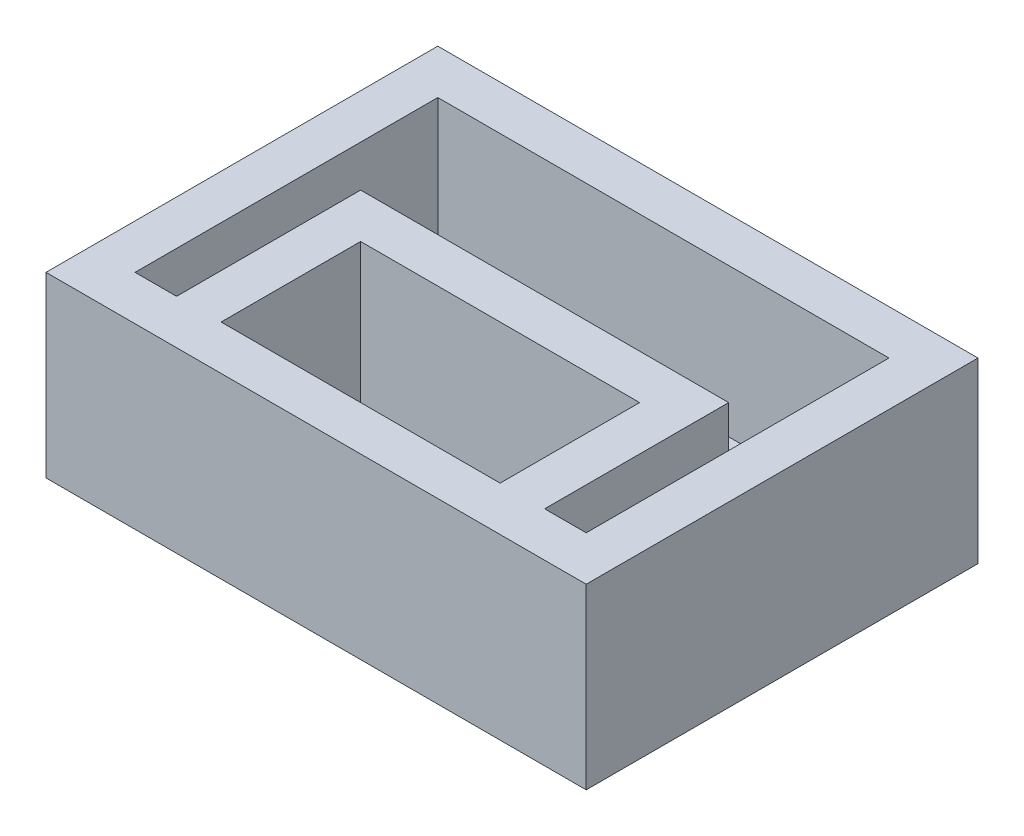
ISO-10303-21;
HEADER;
FILE_DESCRIPTION(('STEP AP214'),'2;1');
FILE_NAME('part.step','',(''),(''),'','','');
FILE_SCHEMA(('AUTOMOTIVE_DESIGN { 1 0 10303 214 1 1 1 1 }'));
ENDSEC;
DATA;
#1=APPLICATION_CONTEXT('core data for automotive mechanical design processes');
#2=APPLICATION_PROTOCOL_DEFINITION('international standard','automotive_design',2000,#1);
#3=PRODUCT_CONTEXT('',#1,'mechanical');
#4=PRODUCT('Part','Part','',(#3));
#5=PRODUCT_RELATED_PRODUCT_CATEGORY('part','',(#4));
#6=PRODUCT_DEFINITION_FORMATION('','',#4);
#7=PRODUCT_DEFINITION_CONTEXT('part definition',#1,'design');
#8=PRODUCT_DEFINITION('design','',#6,#7);
#9=PRODUCT_DEFINITION_SHAPE('','',#8);
#10=(LENGTH_UNIT() NAMED_UNIT(*) SI_UNIT(.MILLI.,.METRE.));
#11=(NAMED_UNIT(*) PLANE_ANGLE_UNIT() SI_UNIT($,.RADIAN.));
#12=(NAMED_UNIT(*) SI_UNIT($,.STERADIAN.) SOLID_ANGLE_UNIT());
#13=UNCERTAINTY_MEASURE_WITH_UNIT(LENGTH_MEASURE(1.E-05),#10,'distance_accuracy_value','');
#14=(GEOMETRIC_REPRESENTATION_CONTEXT(3) GLOBAL_UNCERTAINTY_ASSIGNED_CONTEXT((#13)) GLOBAL_UNIT_ASSIGNED_CONTEXT((#10,
#11,#12)) REPRESENTATION_CONTEXT('',''));
#15=CARTESIAN_POINT('',(0.,0.,0.));
#16=DIRECTION('',(0.,0.,1.));
#17=DIRECTION('',(1.,0.,0.));
#18=AXIS2_PLACEMENT_3D('',#15,#16,#17);
#19=CARTESIAN_POINT('',(-7.6,5.,-5.1));
#20=DIRECTION('',(0.,0.,1.));
#21=DIRECTION('',(1.,0.,0.));
#22=AXIS2_PLACEMENT_3D('',#19,#20,#21);
#23=PLANE('',#22);
#24=DIRECTION('',(-1.,0.,0.));
#25=VECTOR('',#24,1.);
#26=CARTESIAN_POINT('',(-7.6,0.,-5.1));
#27=LINE('',#26,#25);
#28=CARTESIAN_POINT('',(6.2,0.,-5.1));
#29=VERTEX_POINT('',#28);
#30=CARTESIAN_POINT('',(-6.2,0.,-5.1));
#31=VERTEX_POINT('',#30);
#32=EDGE_CURVE('E224',#29,#31,#27,.T.);
#33=ORIENTED_EDGE('',*,*,#32,.F.);
#34=DIRECTION('',(0.,-1.,0.));
#35=VECTOR('',#34,1.);
#36=CARTESIAN_POINT('',(6.2,1.,-5.1));
#37=LINE('',#36,#35);
#38=CARTESIAN_POINT('',(6.2,1.,-5.1));
#39=VERTEX_POINT('',#38);
#40=EDGE_CURVE('E181',#39,#29,#37,.T.);
#41=ORIENTED_EDGE('',*,*,#40,.F.);
#42=DIRECTION('',(-1.,0.,0.));
#43=VECTOR('',#42,1.);
#44=CARTESIAN_POINT('',(7.6,1.,-5.1));
#45=LINE('',#44,#43);
#46=CARTESIAN_POINT('',(7.6,1.,-5.1));
#47=VERTEX_POINT('',#46);
#48=EDGE_CURVE('E167',#47,#39,#45,.T.);
#49=ORIENTED_EDGE('',*,*,#48,.F.);
#50=DIRECTION('',(0.,-1.,0.));
#51=VECTOR('',#50,1.);
#52=CARTESIAN_POINT('',(7.6,5.,-5.1));
#53=LINE('',#52,#51);
#54=CARTESIAN_POINT('',(7.6,5.,-5.1));
#55=VERTEX_POINT('',#54);
#56=EDGE_CURVE('E179',#55,#47,#53,.T.);
#57=ORIENTED_EDGE('',*,*,#56,.F.);
#58=DIRECTION('',(-1.,0.,0.));
#59=VECTOR('',#58,1.);
#60=CARTESIAN_POINT('',(-7.6,5.,-5.1));
#61=LINE('',#60,#59);
#62=CARTESIAN_POINT('',(-7.6,5.,-5.1));
#63=VERTEX_POINT('',#62);
#64=EDGE_CURVE('E318',#55,#63,#61,.T.);
#65=ORIENTED_EDGE('',*,*,#64,.T.);
#66=DIRECTION('',(0.,-1.,0.));
#67=VECTOR('',#66,1.);
#68=CARTESIAN_POINT('',(-7.6,5.,-5.1));
#69=LINE('',#68,#67);
#70=CARTESIAN_POINT('',(-7.6,1.,-5.1));
#71=VERTEX_POINT('',#70);
#72=EDGE_CURVE('E187',#63,#71,#69,.T.);
#73=ORIENTED_EDGE('',*,*,#72,.T.);
#74=DIRECTION('',(-1.,0.,0.));
#75=VECTOR('',#74,1.);
#76=CARTESIAN_POINT('',(-7.6,1.,-5.1));
#77=LINE('',#76,#75);
#78=CARTESIAN_POINT('',(-6.2,1.,-5.1));
#79=VERTEX_POINT('',#78);
#80=EDGE_CURVE('E56',#79,#71,#77,.T.);
#81=ORIENTED_EDGE('',*,*,#80,.F.);
#82=DIRECTION('',(0.,-1.,0.));
#83=VECTOR('',#82,1.);
#84=CARTESIAN_POINT('',(-6.2,1.,-5.1));
#85=LINE('',#84,#83);
#86=EDGE_CURVE('E216',#79,#31,#85,.T.);
#87=ORIENTED_EDGE('',*,*,#86,.T.);
#88=EDGE_LOOP('',(#33,#41,#49,#57,#65,#73,#81,#87));
#89=FACE_BOUND('',#88,.T.);
#90=ADVANCED_FACE('F33',(#89),#23,.T.);
#91=CARTESIAN_POINT('',(0.,0.,0.));
#92=DIRECTION('',(0.,-1.,0.));
#93=DIRECTION('',(0.,0.,-1.));
#94=AXIS2_PLACEMENT_3D('',#91,#92,#93);
#95=PLANE('',#94);
#96=DIRECTION('',(0.,0.,1.));
#97=VECTOR('',#96,1.);
#98=CARTESIAN_POINT('',(6.2,0.,-5.1));
#99=LINE('',#98,#97);
#100=CARTESIAN_POINT('',(6.2,0.,-1.1));
#101=VERTEX_POINT('',#100);
#102=EDGE_CURVE('E174',#29,#101,#99,.T.);
#103=ORIENTED_EDGE('',*,*,#102,.F.);
#104=ORIENTED_EDGE('',*,*,#32,.T.);
#105=DIRECTION('',(0.,0.,-1.));
#106=VECTOR('',#105,1.);
#107=CARTESIAN_POINT('',(-6.2,0.,0.));
#108=LINE('',#107,#106);
#109=CARTESIAN_POINT('',(-6.2,0.,-1.1));
#110=VERTEX_POINT('',#109);
#111=EDGE_CURVE('E41',#110,#31,#108,.T.);
#112=ORIENTED_EDGE('',*,*,#111,.F.);
#113=DIRECTION('',(1.,0.,0.));
#114=VECTOR('',#113,1.);
#115=CARTESIAN_POINT('',(-6.2,0.,-1.1));
#116=LINE('',#115,#114);
#117=EDGE_CURVE('E223',#110,#101,#116,.T.);
#118=ORIENTED_EDGE('',*,*,#117,.T.);
#119=EDGE_LOOP('',(#103,#104,#112,#118));
#120=FACE_BOUND('',#119,.T.);
#121=ADVANCED_FACE('F222',(#120),#95,.F.);
#122=CARTESIAN_POINT('',(6.2,5.,5.1));
#123=DIRECTION('',(0.,0.,-1.));
#124=DIRECTION('',(-1.,0.,0.));
#125=AXIS2_PLACEMENT_3D('',#122,#123,#124);
#126=PLANE('',#125);
#127=DIRECTION('',(0.,-1.,0.));
#128=VECTOR('',#127,1.);
#129=CARTESIAN_POINT('',(7.6,5.,5.1));
#130=LINE('',#129,#128);
#131=CARTESIAN_POINT('',(7.6,5.,5.1));
#132=VERTEX_POINT('',#131);
#133=CARTESIAN_POINT('',(7.6,1.,5.1));
#134=VERTEX_POINT('',#133);
#135=EDGE_CURVE('E186',#132,#134,#130,.T.);
#136=ORIENTED_EDGE('',*,*,#135,.T.);
#137=DIRECTION('',(1.,0.,0.));
#138=VECTOR('',#137,1.);
#139=CARTESIAN_POINT('',(7.6,1.,5.1));
#140=LINE('',#139,#138);
#141=CARTESIAN_POINT('',(6.2,1.,5.1));
#142=VERTEX_POINT('',#141);
#143=EDGE_CURVE('E169',#142,#134,#140,.T.);
#144=ORIENTED_EDGE('',*,*,#143,.F.);
#145=DIRECTION('',(0.,-1.,0.));
#146=VECTOR('',#145,1.);
#147=CARTESIAN_POINT('',(6.2,5.,5.1));
#148=LINE('',#147,#146);
#149=CARTESIAN_POINT('',(6.2,5.,5.1));
#150=VERTEX_POINT('',#149);
#151=EDGE_CURVE('E239',#150,#142,#148,.T.);
#152=ORIENTED_EDGE('',*,*,#151,.F.);
#153=DIRECTION('',(1.,0.,0.));
#154=VECTOR('',#153,1.);
#155=CARTESIAN_POINT('',(6.2,5.,5.1));
#156=LINE('',#155,#154);
#157=EDGE_CURVE('E232',#150,#132,#156,.T.);
#158=ORIENTED_EDGE('',*,*,#157,.T.);
#159=EDGE_LOOP('',(#136,#144,#152,#158));
#160=FACE_BOUND('',#159,.T.);
#161=ADVANCED_FACE('F335',(#160),#126,.T.);
#162=CARTESIAN_POINT('',(7.6,5.,-5.1));
#163=DIRECTION('',(-1.,0.,0.));
#164=DIRECTION('',(0.,0.,1.));
#165=AXIS2_PLACEMENT_3D('',#162,#163,#164);
#166=PLANE('',#165);
#167=ORIENTED_EDGE('',*,*,#56,.T.);
#168=DIRECTION('',(0.,0.,-1.));
#169=VECTOR('',#168,1.);
#170=CARTESIAN_POINT('',(7.6,1.,-5.1));
#171=LINE('',#170,#169);
#172=EDGE_CURVE('E164',#134,#47,#171,.T.);
#173=ORIENTED_EDGE('',*,*,#172,.F.);
#174=ORIENTED_EDGE('',*,*,#135,.F.);
#175=DIRECTION('',(0.,0.,-1.));
#176=VECTOR('',#175,1.);
#177=CARTESIAN_POINT('',(7.6,5.,-5.1));
#178=LINE('',#177,#176);
#179=EDGE_CURVE('E185',#132,#55,#178,.T.);
#180=ORIENTED_EDGE('',*,*,#179,.T.);
#181=EDGE_LOOP('',(#167,#173,#174,#180));
#182=FACE_BOUND('',#181,.T.);
#183=ADVANCED_FACE('F183',(#182),#166,.T.);
#184=CARTESIAN_POINT('',(6.2,5.,-1.1));
#185=DIRECTION('',(1.,0.,0.));
#186=DIRECTION('',(0.,0.,-1.));
#187=AXIS2_PLACEMENT_3D('',#184,#185,#186);
#188=PLANE('',#187);
#189=ORIENTED_EDGE('',*,*,#151,.T.);
#190=DIRECTION('',(0.,0.,-1.));
#191=VECTOR('',#190,1.);
#192=CARTESIAN_POINT('',(6.2,1.,-1.1));
#193=LINE('',#192,#191);
#194=CARTESIAN_POINT('',(6.2,1.,-1.1));
#195=VERTEX_POINT('',#194);
#196=EDGE_CURVE('E11',#142,#195,#193,.T.);
#197=ORIENTED_EDGE('',*,*,#196,.T.);
#198=DIRECTION('',(0.,-1.,0.));
#199=VECTOR('',#198,1.);
#200=CARTESIAN_POINT('',(6.2,5.,-1.1));
#201=LINE('',#200,#199);
#202=CARTESIAN_POINT('',(6.2,5.,-1.1));
#203=VERTEX_POINT('',#202);
#204=EDGE_CURVE('E243',#203,#195,#201,.T.);
#205=ORIENTED_EDGE('',*,*,#204,.F.);
#206=DIRECTION('',(0.,0.,1.));
#207=VECTOR('',#206,1.);
#208=CARTESIAN_POINT('',(6.2,5.,-1.1));
#209=LINE('',#208,#207);
#210=EDGE_CURVE('E242',#203,#150,#209,.T.);
#211=ORIENTED_EDGE('',*,*,#210,.T.);
#212=EDGE_LOOP('',(#189,#197,#205,#211));
#213=FACE_BOUND('',#212,.T.);
#214=ADVANCED_FACE('F330',(#213),#188,.T.);
#215=CARTESIAN_POINT('',(-7.6,5.,-5.1));
#216=DIRECTION('',(1.,0.,0.));
#217=DIRECTION('',(0.,0.,-1.));
#218=AXIS2_PLACEMENT_3D('',#215,#216,#217);
#219=PLANE('',#218);
#220=DIRECTION('',(0.,-1.,0.));
#221=VECTOR('',#220,1.);
#222=CARTESIAN_POINT('',(-7.6,5.,5.1));
#223=LINE('',#222,#221);
#224=CARTESIAN_POINT('',(-7.6,5.,5.1));
#225=VERTEX_POINT('',#224);
#226=CARTESIAN_POINT('',(-7.6,1.,5.1));
#227=VERTEX_POINT('',#226);
#228=EDGE_CURVE('E191',#225,#227,#223,.T.);
#229=ORIENTED_EDGE('',*,*,#228,.T.);
#230=DIRECTION('',(0.,0.,1.));
#231=VECTOR('',#230,1.);
#232=CARTESIAN_POINT('',(-7.6,1.,5.1));
#233=LINE('',#232,#231);
#234=EDGE_CURVE('E255',#71,#227,#233,.T.);
#235=ORIENTED_EDGE('',*,*,#234,.F.);
#236=ORIENTED_EDGE('',*,*,#72,.F.);
#237=DIRECTION('',(0.,0.,1.));
#238=VECTOR('',#237,1.);
#239=CARTESIAN_POINT('',(-7.6,5.,-5.1));
#240=LINE('',#239,#238);
#241=EDGE_CURVE('E257',#63,#225,#240,.T.);
#242=ORIENTED_EDGE('',*,*,#241,.T.);
#243=EDGE_LOOP('',(#229,#235,#236,#242));
#244=FACE_BOUND('',#243,.T.);
#245=ADVANCED_FACE('F253',(#244),#219,.T.);
#246=CARTESIAN_POINT('',(-7.6,5.,5.1));
#247=DIRECTION('',(0.,0.,-1.));
#248=DIRECTION('',(-1.,0.,0.));
#249=AXIS2_PLACEMENT_3D('',#246,#247,#248);
#250=PLANE('',#249);
#251=DIRECTION('',(0.,-1.,0.));
#252=VECTOR('',#251,1.);
#253=CARTESIAN_POINT('',(-6.2,5.,5.1));
#254=LINE('',#253,#252);
#255=CARTESIAN_POINT('',(-6.2,5.,5.1));
#256=VERTEX_POINT('',#255);
#257=CARTESIAN_POINT('',(-6.2,1.,5.1));
#258=VERTEX_POINT('',#257);
#259=EDGE_CURVE('E247',#256,#258,#254,.T.);
#260=ORIENTED_EDGE('',*,*,#259,.T.);
#261=DIRECTION('',(1.,0.,0.));
#262=VECTOR('',#261,1.);
#263=CARTESIAN_POINT('',(-7.6,1.,5.1));
#264=LINE('',#263,#262);
#265=EDGE_CURVE('E264',#227,#258,#264,.T.);
#266=ORIENTED_EDGE('',*,*,#265,.F.);
#267=ORIENTED_EDGE('',*,*,#228,.F.);
#268=DIRECTION('',(1.,0.,0.));
#269=VECTOR('',#268,1.);
#270=CARTESIAN_POINT('',(-7.6,5.,5.1));
#271=LINE('',#270,#269);
#272=EDGE_CURVE('E321',#225,#256,#271,.T.);
#273=ORIENTED_EDGE('',*,*,#272,.T.);
#274=EDGE_LOOP('',(#260,#266,#267,#273));
#275=FACE_BOUND('',#274,.T.);
#276=ADVANCED_FACE('F340',(#275),#250,.T.);
#277=CARTESIAN_POINT('',(-6.2,5.,5.1));
#278=DIRECTION('',(-1.,0.,0.));
#279=DIRECTION('',(0.,0.,1.));
#280=AXIS2_PLACEMENT_3D('',#277,#278,#279);
#281=PLANE('',#280);
#282=DIRECTION('',(0.,-1.,0.));
#283=VECTOR('',#282,1.);
#284=CARTESIAN_POINT('',(-6.2,5.,-1.1));
#285=LINE('',#284,#283);
#286=CARTESIAN_POINT('',(-6.2,5.,-1.1));
#287=VERTEX_POINT('',#286);
#288=CARTESIAN_POINT('',(-6.2,1.,-1.1));
#289=VERTEX_POINT('',#288);
#290=EDGE_CURVE('E245',#287,#289,#285,.T.);
#291=ORIENTED_EDGE('',*,*,#290,.T.);
#292=DIRECTION('',(0.,0.,-1.));
#293=VECTOR('',#292,1.);
#294=CARTESIAN_POINT('',(-6.2,1.,5.1));
#295=LINE('',#294,#293);
#296=EDGE_CURVE('E271',#258,#289,#295,.T.);
#297=ORIENTED_EDGE('',*,*,#296,.F.);
#298=ORIENTED_EDGE('',*,*,#259,.F.);
#299=DIRECTION('',(0.,0.,-1.));
#300=VECTOR('',#299,1.);
#301=CARTESIAN_POINT('',(-6.2,5.,5.1));
#302=LINE('',#301,#300);
#303=EDGE_CURVE('E323',#256,#287,#302,.T.);
#304=ORIENTED_EDGE('',*,*,#303,.T.);
#305=EDGE_LOOP('',(#291,#297,#298,#304));
#306=FACE_BOUND('',#305,.T.);
#307=ADVANCED_FACE('F342',(#306),#281,.T.);
#308=CARTESIAN_POINT('',(0.,5.,0.));
#309=DIRECTION('',(0.,1.,0.));
#310=DIRECTION('',(0.,0.,1.));
#311=AXIS2_PLACEMENT_3D('',#308,#309,#310);
#312=PLANE('',#311);
#313=DIRECTION('',(0.,0.,-1.));
#314=VECTOR('',#313,1.);
#315=CARTESIAN_POINT('',(9.1,5.,-6.6));
#316=LINE('',#315,#314);
#317=CARTESIAN_POINT('',(9.1,5.,6.6));
#318=VERTEX_POINT('',#317);
#319=CARTESIAN_POINT('',(9.1,5.,-6.6));
#320=VERTEX_POINT('',#319);
#321=EDGE_CURVE('E189',#318,#320,#316,.T.);
#322=ORIENTED_EDGE('',*,*,#321,.T.);
#323=DIRECTION('',(-1.,0.,0.));
#324=VECTOR('',#323,1.);
#325=CARTESIAN_POINT('',(-9.1,5.,-6.6));
#326=LINE('',#325,#324);
#327=CARTESIAN_POINT('',(-9.1,5.,-6.6));
#328=VERTEX_POINT('',#327);
#329=EDGE_CURVE('E197',#320,#328,#326,.T.);
#330=ORIENTED_EDGE('',*,*,#329,.T.);
#331=DIRECTION('',(0.,0.,1.));
#332=VECTOR('',#331,1.);
#333=CARTESIAN_POINT('',(-9.1,5.,-6.6));
#334=LINE('',#333,#332);
#335=CARTESIAN_POINT('',(-9.1,5.,6.6));
#336=VERTEX_POINT('',#335);
#337=EDGE_CURVE('E199',#328,#336,#334,.T.);
#338=ORIENTED_EDGE('',*,*,#337,.T.);
#339=DIRECTION('',(1.,0.,0.));
#340=VECTOR('',#339,1.);
#341=CARTESIAN_POINT('',(-9.1,5.,6.6));
#342=LINE('',#341,#340);
#343=EDGE_CURVE('E201',#336,#318,#342,.T.);
#344=ORIENTED_EDGE('',*,*,#343,.T.);
#345=EDGE_LOOP('',(#322,#330,#338,#344));
#346=FACE_BOUND('',#345,.T.);
#347=ORIENTED_EDGE('',*,*,#179,.F.);
#348=ORIENTED_EDGE('',*,*,#157,.F.);
#349=ORIENTED_EDGE('',*,*,#210,.F.);
#350=DIRECTION('',(1.,0.,0.));
#351=VECTOR('',#350,1.);
#352=CARTESIAN_POINT('',(-6.2,5.,-1.1));
#353=LINE('',#352,#351);
#354=EDGE_CURVE('E325',#287,#203,#353,.T.);
#355=ORIENTED_EDGE('',*,*,#354,.F.);
#356=ORIENTED_EDGE('',*,*,#303,.F.);
#357=ORIENTED_EDGE('',*,*,#272,.F.);
#358=ORIENTED_EDGE('',*,*,#241,.F.);
#359=ORIENTED_EDGE('',*,*,#64,.F.);
#360=EDGE_LOOP('',(#347,#348,#349,#355,#356,#357,#358,#359));
#361=FACE_BOUND('',#360,.T.);
#362=DIRECTION('',(0.,0.,-1.));
#363=VECTOR('',#362,1.);
#364=CARTESIAN_POINT('',(4.7,5.,5.1));
#365=LINE('',#364,#363);
#366=CARTESIAN_POINT('',(4.7,5.,5.1));
#367=VERTEX_POINT('',#366);
#368=CARTESIAN_POINT('',(4.7,5.,0.4));
#369=VERTEX_POINT('',#368);
#370=EDGE_CURVE('E291',#367,#369,#365,.T.);
#371=ORIENTED_EDGE('',*,*,#370,.F.);
#372=DIRECTION('',(1.,0.,0.));
#373=VECTOR('',#372,1.);
#374=CARTESIAN_POINT('',(-4.7,5.,5.1));
#375=LINE('',#374,#373);
#376=CARTESIAN_POINT('',(-4.7,5.,5.1));
#377=VERTEX_POINT('',#376);
#378=EDGE_CURVE('E289',#377,#367,#375,.T.);
#379=ORIENTED_EDGE('',*,*,#378,.F.);
#380=DIRECTION('',(0.,0.,1.));
#381=VECTOR('',#380,1.);
#382=CARTESIAN_POINT('',(-4.7,5.,0.400000000000001));
#383=LINE('',#382,#381);
#384=CARTESIAN_POINT('',(-4.7,5.,0.400000000000001));
#385=VERTEX_POINT('',#384);
#386=EDGE_CURVE('E297',#385,#377,#383,.T.);
#387=ORIENTED_EDGE('',*,*,#386,.F.);
#388=DIRECTION('',(-1.,0.,0.));
#389=VECTOR('',#388,1.);
#390=CARTESIAN_POINT('',(4.7,5.,0.4));
#391=LINE('',#390,#389);
#392=EDGE_CURVE('E294',#369,#385,#391,.T.);
#393=ORIENTED_EDGE('',*,*,#392,.F.);
#394=EDGE_LOOP('',(#371,#379,#387,#393));
#395=FACE_BOUND('',#394,.T.);
#396=ADVANCED_FACE('F336',(#346,#361,#395),#312,.T.);
#397=CARTESIAN_POINT('',(9.1,5.,-6.6));
#398=DIRECTION('',(-1.,0.,0.));
#399=DIRECTION('',(0.,0.,1.));
#400=AXIS2_PLACEMENT_3D('',#397,#398,#399);
#401=PLANE('',#400);
#402=DIRECTION('',(0.,-1.,0.));
#403=VECTOR('',#402,1.);
#404=CARTESIAN_POINT('',(9.1,5.,6.6));
#405=LINE('',#404,#403);
#406=CARTESIAN_POINT('',(9.1,-1.,6.6));
#407=VERTEX_POINT('',#406);
#408=EDGE_CURVE('E203',#318,#407,#405,.T.);
#409=ORIENTED_EDGE('',*,*,#408,.T.);
#410=DIRECTION('',(0.,0.,1.));
#411=VECTOR('',#410,1.);
#412=CARTESIAN_POINT('',(9.1,-1.,6.6));
#413=LINE('',#412,#411);
#414=CARTESIAN_POINT('',(9.1,-1.,-6.6));
#415=VERTEX_POINT('',#414);
#416=EDGE_CURVE('E282',#415,#407,#413,.T.);
#417=ORIENTED_EDGE('',*,*,#416,.F.);
#418=DIRECTION('',(0.,-1.,0.));
#419=VECTOR('',#418,1.);
#420=CARTESIAN_POINT('',(9.1,5.,-6.6));
#421=LINE('',#420,#419);
#422=EDGE_CURVE('E209',#320,#415,#421,.T.);
#423=ORIENTED_EDGE('',*,*,#422,.F.);
#424=ORIENTED_EDGE('',*,*,#321,.F.);
#425=EDGE_LOOP('',(#409,#417,#423,#424));
#426=FACE_BOUND('',#425,.T.);
#427=ADVANCED_FACE('F35',(#426),#401,.F.);
#428=CARTESIAN_POINT('',(-9.1,5.,-6.6));
#429=DIRECTION('',(0.,0.,1.));
#430=DIRECTION('',(1.,0.,0.));
#431=AXIS2_PLACEMENT_3D('',#428,#429,#430);
#432=PLANE('',#431);
#433=ORIENTED_EDGE('',*,*,#422,.T.);
#434=DIRECTION('',(1.,0.,0.));
#435=VECTOR('',#434,1.);
#436=CARTESIAN_POINT('',(-9.1,-1.,-6.6));
#437=LINE('',#436,#435);
#438=CARTESIAN_POINT('',(-9.1,-1.,-6.6));
#439=VERTEX_POINT('',#438);
#440=EDGE_CURVE('E279',#439,#415,#437,.T.);
#441=ORIENTED_EDGE('',*,*,#440,.F.);
#442=DIRECTION('',(0.,-1.,0.));
#443=VECTOR('',#442,1.);
#444=CARTESIAN_POINT('',(-9.1,5.,-6.6));
#445=LINE('',#444,#443);
#446=EDGE_CURVE('E207',#328,#439,#445,.T.);
#447=ORIENTED_EDGE('',*,*,#446,.F.);
#448=ORIENTED_EDGE('',*,*,#329,.F.);
#449=EDGE_LOOP('',(#433,#441,#447,#448));
#450=FACE_BOUND('',#449,.T.);
#451=ADVANCED_FACE('F372',(#450),#432,.F.);
#452=CARTESIAN_POINT('',(-9.1,5.,-6.6));
#453=DIRECTION('',(1.,0.,0.));
#454=DIRECTION('',(0.,0.,-1.));
#455=AXIS2_PLACEMENT_3D('',#452,#453,#454);
#456=PLANE('',#455);
#457=ORIENTED_EDGE('',*,*,#446,.T.);
#458=DIRECTION('',(0.,0.,-1.));
#459=VECTOR('',#458,1.);
#460=CARTESIAN_POINT('',(-9.1,-1.,6.6));
#461=LINE('',#460,#459);
#462=CARTESIAN_POINT('',(-9.1,-1.,6.6));
#463=VERTEX_POINT('',#462);
#464=EDGE_CURVE('E276',#463,#439,#461,.T.);
#465=ORIENTED_EDGE('',*,*,#464,.F.);
#466=DIRECTION('',(0.,-1.,0.));
#467=VECTOR('',#466,1.);
#468=CARTESIAN_POINT('',(-9.1,5.,6.6));
#469=LINE('',#468,#467);
#470=EDGE_CURVE('E205',#336,#463,#469,.T.);
#471=ORIENTED_EDGE('',*,*,#470,.F.);
#472=ORIENTED_EDGE('',*,*,#337,.F.);
#473=EDGE_LOOP('',(#457,#465,#471,#472));
#474=FACE_BOUND('',#473,.T.);
#475=ADVANCED_FACE('F369',(#474),#456,.F.);
#476=CARTESIAN_POINT('',(-9.1,5.,6.6));
#477=DIRECTION('',(0.,0.,-1.));
#478=DIRECTION('',(-1.,0.,0.));
#479=AXIS2_PLACEMENT_3D('',#476,#477,#478);
#480=PLANE('',#479);
#481=ORIENTED_EDGE('',*,*,#470,.T.);
#482=DIRECTION('',(-1.,0.,0.));
#483=VECTOR('',#482,1.);
#484=CARTESIAN_POINT('',(-9.1,-1.,6.6));
#485=LINE('',#484,#483);
#486=EDGE_CURVE('E285',#407,#463,#485,.T.);
#487=ORIENTED_EDGE('',*,*,#486,.F.);
#488=ORIENTED_EDGE('',*,*,#408,.F.);
#489=ORIENTED_EDGE('',*,*,#343,.F.);
#490=EDGE_LOOP('',(#481,#487,#488,#489));
#491=FACE_BOUND('',#490,.T.);
#492=ADVANCED_FACE('F366',(#491),#480,.F.);
#493=CARTESIAN_POINT('',(-6.2,5.,-1.1));
#494=DIRECTION('',(0.,0.,-1.));
#495=DIRECTION('',(-1.,0.,0.));
#496=AXIS2_PLACEMENT_3D('',#493,#494,#495);
#497=PLANE('',#496);
#498=ORIENTED_EDGE('',*,*,#117,.F.);
#499=DIRECTION('',(0.,1.,0.));
#500=VECTOR('',#499,1.);
#501=CARTESIAN_POINT('',(-6.2,5.,-1.1));
#502=LINE('',#501,#500);
#503=EDGE_CURVE('E217',#110,#289,#502,.T.);
#504=ORIENTED_EDGE('',*,*,#503,.T.);
#505=ORIENTED_EDGE('',*,*,#290,.F.);
#506=ORIENTED_EDGE('',*,*,#354,.T.);
#507=ORIENTED_EDGE('',*,*,#204,.T.);
#508=EDGE_CURVE('E231',#195,#101,#201,.T.);
#509=ORIENTED_EDGE('',*,*,#508,.T.);
#510=EDGE_LOOP('',(#498,#504,#505,#506,#507,#509));
#511=FACE_BOUND('',#510,.T.);
#512=ADVANCED_FACE('F227',(#511),#497,.T.);
#513=CARTESIAN_POINT('',(-4.7,5.,5.1));
#514=DIRECTION('',(0.,0.,-1.));
#515=DIRECTION('',(-1.,0.,0.));
#516=AXIS2_PLACEMENT_3D('',#513,#514,#515);
#517=PLANE('',#516);
#518=DIRECTION('',(1.,0.,0.));
#519=VECTOR('',#518,1.);
#520=CARTESIAN_POINT('',(-4.7,0.,5.1));
#521=LINE('',#520,#519);
#522=CARTESIAN_POINT('',(-4.7,0.,5.1));
#523=VERTEX_POINT('',#522);
#524=CARTESIAN_POINT('',(4.7,0.,5.1));
#525=VERTEX_POINT('',#524);
#526=EDGE_CURVE('E288',#523,#525,#521,.T.);
#527=ORIENTED_EDGE('',*,*,#526,.F.);
#528=DIRECTION('',(0.,-1.,0.));
#529=VECTOR('',#528,1.);
#530=CARTESIAN_POINT('',(-4.7,5.,5.1));
#531=LINE('',#530,#529);
#532=EDGE_CURVE('E299',#377,#523,#531,.T.);
#533=ORIENTED_EDGE('',*,*,#532,.F.);
#534=ORIENTED_EDGE('',*,*,#378,.T.);
#535=DIRECTION('',(0.,-1.,0.));
#536=VECTOR('',#535,1.);
#537=CARTESIAN_POINT('',(4.7,5.,5.1));
#538=LINE('',#537,#536);
#539=EDGE_CURVE('E235',#367,#525,#538,.T.);
#540=ORIENTED_EDGE('',*,*,#539,.T.);
#541=EDGE_LOOP('',(#527,#533,#534,#540));
#542=FACE_BOUND('',#541,.T.);
#543=ADVANCED_FACE('F414',(#542),#517,.T.);
#544=CARTESIAN_POINT('',(4.7,5.,5.1));
#545=DIRECTION('',(-1.,0.,0.));
#546=DIRECTION('',(0.,0.,1.));
#547=AXIS2_PLACEMENT_3D('',#544,#545,#546);
#548=PLANE('',#547);
#549=DIRECTION('',(0.,0.,-1.));
#550=VECTOR('',#549,1.);
#551=CARTESIAN_POINT('',(4.7,0.,5.1));
#552=LINE('',#551,#550);
#553=CARTESIAN_POINT('',(4.7,0.,0.4));
#554=VERTEX_POINT('',#553);
#555=EDGE_CURVE('E302',#525,#554,#552,.T.);
#556=ORIENTED_EDGE('',*,*,#555,.F.);
#557=ORIENTED_EDGE('',*,*,#539,.F.);
#558=ORIENTED_EDGE('',*,*,#370,.T.);
#559=DIRECTION('',(0.,-1.,0.));
#560=VECTOR('',#559,1.);
#561=CARTESIAN_POINT('',(4.7,5.,0.4));
#562=LINE('',#561,#560);
#563=EDGE_CURVE('E313',#369,#554,#562,.T.);
#564=ORIENTED_EDGE('',*,*,#563,.T.);
#565=EDGE_LOOP('',(#556,#557,#558,#564));
#566=FACE_BOUND('',#565,.T.);
#567=ADVANCED_FACE('F410',(#566),#548,.T.);
#568=CARTESIAN_POINT('',(4.7,5.,0.4));
#569=DIRECTION('',(0.,0.,1.));
#570=DIRECTION('',(1.,0.,0.));
#571=AXIS2_PLACEMENT_3D('',#568,#569,#570);
#572=PLANE('',#571);
#573=DIRECTION('',(-1.,0.,0.));
#574=VECTOR('',#573,1.);
#575=CARTESIAN_POINT('',(4.7,0.,0.4));
#576=LINE('',#575,#574);
#577=CARTESIAN_POINT('',(-4.7,0.,0.400000000000001));
#578=VERTEX_POINT('',#577);
#579=EDGE_CURVE('E305',#554,#578,#576,.T.);
#580=ORIENTED_EDGE('',*,*,#579,.F.);
#581=ORIENTED_EDGE('',*,*,#563,.F.);
#582=ORIENTED_EDGE('',*,*,#392,.T.);
#583=DIRECTION('',(0.,-1.,0.));
#584=VECTOR('',#583,1.);
#585=CARTESIAN_POINT('',(-4.7,5.,0.400000000000001));
#586=LINE('',#585,#584);
#587=EDGE_CURVE('E311',#385,#578,#586,.T.);
#588=ORIENTED_EDGE('',*,*,#587,.T.);
#589=EDGE_LOOP('',(#580,#581,#582,#588));
#590=FACE_BOUND('',#589,.T.);
#591=ADVANCED_FACE('F406',(#590),#572,.T.);
#592=CARTESIAN_POINT('',(-4.7,5.,0.400000000000001));
#593=DIRECTION('',(1.,0.,0.));
#594=DIRECTION('',(0.,0.,-1.));
#595=AXIS2_PLACEMENT_3D('',#592,#593,#594);
#596=PLANE('',#595);
#597=DIRECTION('',(0.,0.,1.));
#598=VECTOR('',#597,1.);
#599=CARTESIAN_POINT('',(-4.7,0.,0.400000000000001));
#600=LINE('',#599,#598);
#601=EDGE_CURVE('E292',#578,#523,#600,.T.);
#602=ORIENTED_EDGE('',*,*,#601,.F.);
#603=ORIENTED_EDGE('',*,*,#587,.F.);
#604=ORIENTED_EDGE('',*,*,#386,.T.);
#605=ORIENTED_EDGE('',*,*,#532,.T.);
#606=EDGE_LOOP('',(#602,#603,#604,#605));
#607=FACE_BOUND('',#606,.T.);
#608=ADVANCED_FACE('F400',(#607),#596,.T.);
#609=ORIENTED_EDGE('',*,*,#601,.T.);
#610=ORIENTED_EDGE('',*,*,#526,.T.);
#611=ORIENTED_EDGE('',*,*,#555,.T.);
#612=ORIENTED_EDGE('',*,*,#579,.T.);
#613=EDGE_LOOP('',(#609,#610,#611,#612));
#614=FACE_BOUND('',#613,.T.);
#615=ADVANCED_FACE('F359',(#614),#95,.F.);
#616=CARTESIAN_POINT('',(0.,-1.,0.));
#617=DIRECTION('',(0.,-1.,0.));
#618=DIRECTION('',(0.,0.,-1.));
#619=AXIS2_PLACEMENT_3D('',#616,#617,#618);
#620=PLANE('',#619);
#621=ORIENTED_EDGE('',*,*,#464,.T.);
#622=ORIENTED_EDGE('',*,*,#440,.T.);
#623=ORIENTED_EDGE('',*,*,#416,.T.);
#624=ORIENTED_EDGE('',*,*,#486,.T.);
#625=EDGE_LOOP('',(#621,#622,#623,#624));
#626=FACE_BOUND('',#625,.T.);
#627=ADVANCED_FACE('F386',(#626),#620,.T.);
#628=CARTESIAN_POINT('',(-6.2,1.,5.1));
#629=DIRECTION('',(-1.,0.,0.));
#630=DIRECTION('',(0.,0.,1.));
#631=AXIS2_PLACEMENT_3D('',#628,#629,#630);
#632=PLANE('',#631);
#633=ORIENTED_EDGE('',*,*,#503,.F.);
#634=ORIENTED_EDGE('',*,*,#111,.T.);
#635=ORIENTED_EDGE('',*,*,#86,.F.);
#636=EDGE_CURVE('E266',#289,#79,#295,.T.);
#637=ORIENTED_EDGE('',*,*,#636,.F.);
#638=EDGE_LOOP('',(#633,#634,#635,#637));
#639=FACE_BOUND('',#638,.T.);
#640=ADVANCED_FACE('F214',(#639),#632,.F.);
#641=CARTESIAN_POINT('',(0.,1.,0.));
#642=DIRECTION('',(0.,-1.,0.));
#643=DIRECTION('',(0.,0.,-1.));
#644=AXIS2_PLACEMENT_3D('',#641,#642,#643);
#645=PLANE('',#644);
#646=ORIENTED_EDGE('',*,*,#234,.T.);
#647=ORIENTED_EDGE('',*,*,#265,.T.);
#648=ORIENTED_EDGE('',*,*,#296,.T.);
#649=ORIENTED_EDGE('',*,*,#636,.T.);
#650=ORIENTED_EDGE('',*,*,#80,.T.);
#651=EDGE_LOOP('',(#646,#647,#648,#649,#650));
#652=FACE_BOUND('',#651,.T.);
#653=ADVANCED_FACE('F262',(#652),#645,.F.);
#654=CARTESIAN_POINT('',(6.2,1.,-5.1));
#655=DIRECTION('',(1.,0.,0.));
#656=DIRECTION('',(0.,0.,-1.));
#657=AXIS2_PLACEMENT_3D('',#654,#655,#656);
#658=PLANE('',#657);
#659=ORIENTED_EDGE('',*,*,#508,.F.);
#660=DIRECTION('',(0.,0.,1.));
#661=VECTOR('',#660,1.);
#662=CARTESIAN_POINT('',(6.2,1.,-5.1));
#663=LINE('',#662,#661);
#664=EDGE_CURVE('E48',#39,#195,#663,.T.);
#665=ORIENTED_EDGE('',*,*,#664,.F.);
#666=ORIENTED_EDGE('',*,*,#40,.T.);
#667=ORIENTED_EDGE('',*,*,#102,.T.);
#668=EDGE_LOOP('',(#659,#665,#666,#667));
#669=FACE_BOUND('',#668,.T.);
#670=ADVANCED_FACE('F510',(#669),#658,.F.);
#671=CARTESIAN_POINT('',(0.,1.,0.));
#672=DIRECTION('',(0.,-1.,0.));
#673=DIRECTION('',(0.,0.,-1.));
#674=AXIS2_PLACEMENT_3D('',#671,#672,#673);
#675=PLANE('',#674);
#676=ORIENTED_EDGE('',*,*,#172,.T.);
#677=ORIENTED_EDGE('',*,*,#48,.T.);
#678=ORIENTED_EDGE('',*,*,#664,.T.);
#679=ORIENTED_EDGE('',*,*,#196,.F.);
#680=ORIENTED_EDGE('',*,*,#143,.T.);
#681=EDGE_LOOP('',(#676,#677,#678,#679,#680));
#682=FACE_BOUND('',#681,.T.);
#683=ADVANCED_FACE('F166',(#682),#675,.F.);
#684=CLOSED_SHELL('',(#90,#121,#161,#183,#214,#245,#276,#307,#396,#427,#451,#475,#492,#512,#543,
#567,#591,#608,#615,#627,#640,#653,#670,#683));
#685=MANIFOLD_SOLID_BREP('B2',#684);
#686=ADVANCED_BREP_SHAPE_REPRESENTATION('',(#18,#685),#14);
#687=SHAPE_DEFINITION_REPRESENTATION(#9,#686);
ENDSEC;
END-ISO-10303-21;
